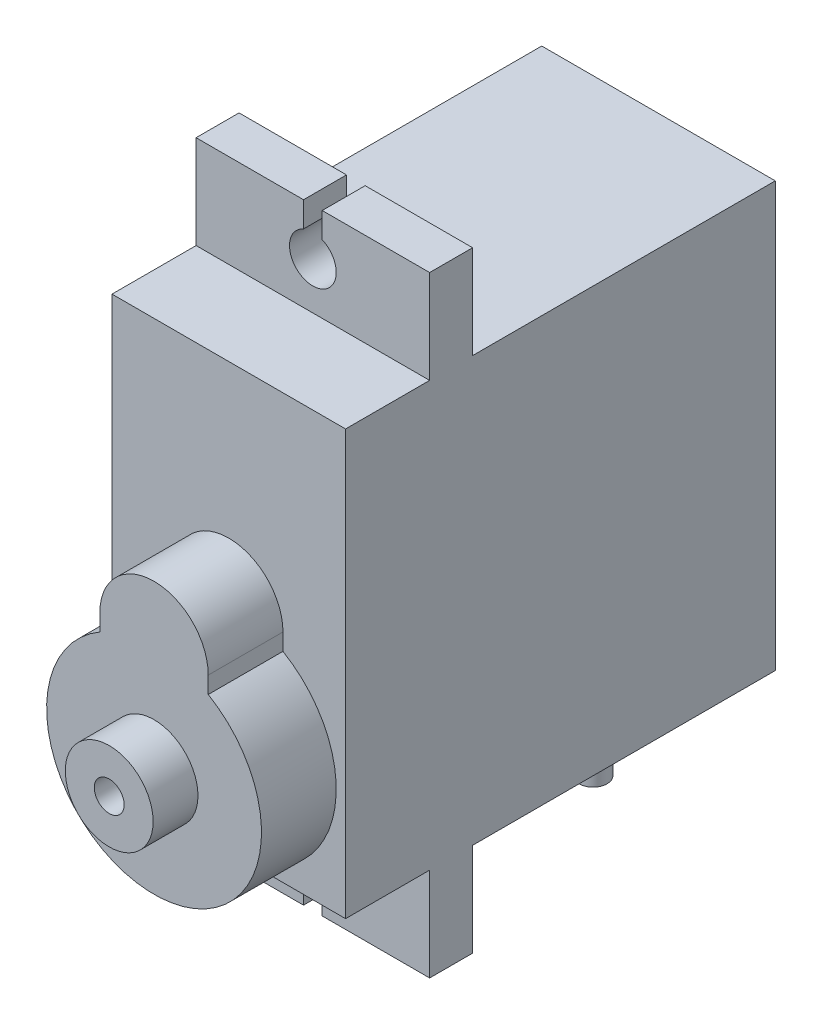
ISO-10303-21;
HEADER;
FILE_DESCRIPTION(('STEP AP214'),'2;1');
FILE_NAME('part.step','',(''),(''),'','','');
FILE_SCHEMA(('AUTOMOTIVE_DESIGN { 1 0 10303 214 1 1 1 1 }'));
ENDSEC;
DATA;
#1=APPLICATION_CONTEXT('core data for automotive mechanical design processes');
#2=APPLICATION_PROTOCOL_DEFINITION('international standard','automotive_design',2000,#1);
#3=PRODUCT_CONTEXT('',#1,'mechanical');
#4=PRODUCT('Part','Part','',(#3));
#5=PRODUCT_RELATED_PRODUCT_CATEGORY('part','',(#4));
#6=PRODUCT_DEFINITION_FORMATION('','',#4);
#7=PRODUCT_DEFINITION_CONTEXT('part definition',#1,'design');
#8=PRODUCT_DEFINITION('design','',#6,#7);
#9=PRODUCT_DEFINITION_SHAPE('','',#8);
#10=(LENGTH_UNIT() NAMED_UNIT(*) SI_UNIT(.MILLI.,.METRE.));
#11=(NAMED_UNIT(*) PLANE_ANGLE_UNIT() SI_UNIT($,.RADIAN.));
#12=(NAMED_UNIT(*) SI_UNIT($,.STERADIAN.) SOLID_ANGLE_UNIT());
#13=UNCERTAINTY_MEASURE_WITH_UNIT(LENGTH_MEASURE(1.E-05),#10,'distance_accuracy_value','');
#14=(GEOMETRIC_REPRESENTATION_CONTEXT(3) GLOBAL_UNCERTAINTY_ASSIGNED_CONTEXT((#13)) GLOBAL_UNIT_ASSIGNED_CONTEXT((#10,
#11,#12)) REPRESENTATION_CONTEXT('',''));
#15=CARTESIAN_POINT('',(0.,0.,0.));
#16=DIRECTION('',(0.,0.,1.));
#17=DIRECTION('',(1.,0.,0.));
#18=AXIS2_PLACEMENT_3D('',#15,#16,#17);
#19=CARTESIAN_POINT('',(-6.25000000000001,-11.35,23.));
#20=DIRECTION('',(0.,1.,0.));
#21=DIRECTION('',(0.,0.,1.));
#22=AXIS2_PLACEMENT_3D('',#19,#20,#21);
#23=PLANE('',#22);
#24=DIRECTION('',(-1.,0.,0.));
#25=VECTOR('',#24,1.);
#26=CARTESIAN_POINT('',(6.25,-11.35,16.2));
#27=LINE('',#26,#25);
#28=CARTESIAN_POINT('',(6.24999999999999,-11.35,16.2));
#29=VERTEX_POINT('',#28);
#30=CARTESIAN_POINT('',(-6.25,-11.35,16.2));
#31=VERTEX_POINT('',#30);
#32=EDGE_CURVE('E334',#29,#31,#27,.T.);
#33=ORIENTED_EDGE('',*,*,#32,.T.);
#34=DIRECTION('',(0.,0.,-1.));
#35=VECTOR('',#34,1.);
#36=CARTESIAN_POINT('',(-6.25000000000001,-11.35,23.));
#37=LINE('',#36,#35);
#38=CARTESIAN_POINT('',(-6.25000000000001,-11.35,0.));
#39=VERTEX_POINT('',#38);
#40=EDGE_CURVE('E409',#31,#39,#37,.T.);
#41=ORIENTED_EDGE('',*,*,#40,.T.);
#42=DIRECTION('',(1.,0.,0.));
#43=VECTOR('',#42,1.);
#44=CARTESIAN_POINT('',(-6.25000000000001,-11.35,0.));
#45=LINE('',#44,#43);
#46=CARTESIAN_POINT('',(6.24999999999999,-11.35,0.));
#47=VERTEX_POINT('',#46);
#48=EDGE_CURVE('E504',#39,#47,#45,.T.);
#49=ORIENTED_EDGE('',*,*,#48,.T.);
#50=DIRECTION('',(0.,0.,-1.));
#51=VECTOR('',#50,1.);
#52=CARTESIAN_POINT('',(6.24999999999999,-11.35,23.));
#53=LINE('',#52,#51);
#54=EDGE_CURVE('E497',#29,#47,#53,.T.);
#55=ORIENTED_EDGE('',*,*,#54,.F.);
#56=EDGE_LOOP('',(#33,#41,#49,#55));
#57=FACE_BOUND('',#56,.T.);
#58=CARTESIAN_POINT('',(1.25,-11.35,4.75));
#59=DIRECTION('',(0.,1.,0.));
#60=DIRECTION('',(0.,0.,1.));
#61=AXIS2_PLACEMENT_3D('',#58,#59,#60);
#62=CIRCLE('',#61,0.75);
#63=CARTESIAN_POINT('',(0.625,-11.35,4.33542190120558));
#64=VERTEX_POINT('',#63);
#65=CARTESIAN_POINT('',(0.625000000000001,-11.35,5.16457809879443));
#66=VERTEX_POINT('',#65);
#67=EDGE_CURVE('E246',#64,#66,#62,.F.);
#68=ORIENTED_EDGE('',*,*,#67,.F.);
#69=CARTESIAN_POINT('',(0.,-11.35,4.75));
#70=DIRECTION('',(0.,1.,0.));
#71=DIRECTION('',(0.,0.,1.));
#72=AXIS2_PLACEMENT_3D('',#69,#70,#71);
#73=CIRCLE('',#72,0.75);
#74=CARTESIAN_POINT('',(-0.625,-11.35,4.33542190120558));
#75=VERTEX_POINT('',#74);
#76=EDGE_CURVE('E258',#75,#64,#73,.F.);
#77=ORIENTED_EDGE('',*,*,#76,.F.);
#78=CARTESIAN_POINT('',(-1.25,-11.35,4.75));
#79=DIRECTION('',(0.,1.,0.));
#80=DIRECTION('',(0.,0.,1.));
#81=AXIS2_PLACEMENT_3D('',#78,#79,#80);
#82=CIRCLE('',#81,0.75);
#83=CARTESIAN_POINT('',(-0.625,-11.35,5.16457809879442));
#84=VERTEX_POINT('',#83);
#85=EDGE_CURVE('E245',#84,#75,#82,.F.);
#86=ORIENTED_EDGE('',*,*,#85,.F.);
#87=CARTESIAN_POINT('',(0.,-11.35,4.75));
#88=DIRECTION('',(0.,1.,0.));
#89=DIRECTION('',(0.,0.,1.));
#90=AXIS2_PLACEMENT_3D('',#87,#88,#89);
#91=CIRCLE('',#90,0.75);
#92=EDGE_CURVE('E235',#66,#84,#91,.F.);
#93=ORIENTED_EDGE('',*,*,#92,.F.);
#94=EDGE_LOOP('',(#68,#77,#86,#93));
#95=FACE_BOUND('',#94,.T.);
#96=ADVANCED_FACE('F45',(#57,#95),#23,.F.);
#97=CARTESIAN_POINT('',(6.25,-16.35,16.2));
#98=DIRECTION('',(0.,1.,0.));
#99=DIRECTION('',(0.,0.,1.));
#100=AXIS2_PLACEMENT_3D('',#97,#98,#99);
#101=PLANE('',#100);
#102=DIRECTION('',(-1.,0.,0.));
#103=VECTOR('',#102,1.);
#104=CARTESIAN_POINT('',(6.25,-16.35,18.5));
#105=LINE('',#104,#103);
#106=CARTESIAN_POINT('',(6.25,-16.35,18.5));
#107=VERTEX_POINT('',#106);
#108=CARTESIAN_POINT('',(0.5,-16.35,18.5));
#109=VERTEX_POINT('',#108);
#110=EDGE_CURVE('E349',#107,#109,#105,.T.);
#111=ORIENTED_EDGE('',*,*,#110,.T.);
#112=DIRECTION('',(0.,0.,1.));
#113=VECTOR('',#112,1.);
#114=CARTESIAN_POINT('',(0.5,-16.35,-0.00102500000000172));
#115=LINE('',#114,#113);
#116=CARTESIAN_POINT('',(0.5,-16.35,16.2));
#117=VERTEX_POINT('',#116);
#118=EDGE_CURVE('E297',#117,#109,#115,.T.);
#119=ORIENTED_EDGE('',*,*,#118,.F.);
#120=DIRECTION('',(-1.,0.,0.));
#121=VECTOR('',#120,1.);
#122=CARTESIAN_POINT('',(6.25,-16.35,16.2));
#123=LINE('',#122,#121);
#124=CARTESIAN_POINT('',(6.25,-16.35,16.2));
#125=VERTEX_POINT('',#124);
#126=EDGE_CURVE('E345',#125,#117,#123,.T.);
#127=ORIENTED_EDGE('',*,*,#126,.F.);
#128=DIRECTION('',(0.,0.,-1.));
#129=VECTOR('',#128,1.);
#130=CARTESIAN_POINT('',(6.25,-16.35,16.2));
#131=LINE('',#130,#129);
#132=EDGE_CURVE('E328',#107,#125,#131,.T.);
#133=ORIENTED_EDGE('',*,*,#132,.F.);
#134=EDGE_LOOP('',(#111,#119,#127,#133));
#135=FACE_BOUND('',#134,.T.);
#136=ADVANCED_FACE('F570',(#135),#101,.F.);
#137=CARTESIAN_POINT('',(6.25,16.35,16.2));
#138=DIRECTION('',(0.,-1.,0.));
#139=DIRECTION('',(0.,0.,-1.));
#140=AXIS2_PLACEMENT_3D('',#137,#138,#139);
#141=PLANE('',#140);
#142=DIRECTION('',(-1.,0.,0.));
#143=VECTOR('',#142,1.);
#144=CARTESIAN_POINT('',(6.25,16.35,16.2));
#145=LINE('',#144,#143);
#146=CARTESIAN_POINT('',(6.25,16.35,16.2));
#147=VERTEX_POINT('',#146);
#148=CARTESIAN_POINT('',(0.5,16.35,16.2));
#149=VERTEX_POINT('',#148);
#150=EDGE_CURVE('E463',#147,#149,#145,.T.);
#151=ORIENTED_EDGE('',*,*,#150,.T.);
#152=DIRECTION('',(0.,0.,1.));
#153=VECTOR('',#152,1.);
#154=CARTESIAN_POINT('',(0.5,16.35,-0.00102500000000172));
#155=LINE('',#154,#153);
#156=CARTESIAN_POINT('',(0.5,16.35,18.5));
#157=VERTEX_POINT('',#156);
#158=EDGE_CURVE('E317',#149,#157,#155,.T.);
#159=ORIENTED_EDGE('',*,*,#158,.T.);
#160=DIRECTION('',(-1.,0.,0.));
#161=VECTOR('',#160,1.);
#162=CARTESIAN_POINT('',(6.25,16.35,18.5));
#163=LINE('',#162,#161);
#164=CARTESIAN_POINT('',(6.25,16.35,18.5));
#165=VERTEX_POINT('',#164);
#166=EDGE_CURVE('E476',#165,#157,#163,.T.);
#167=ORIENTED_EDGE('',*,*,#166,.F.);
#168=DIRECTION('',(0.,0.,1.));
#169=VECTOR('',#168,1.);
#170=CARTESIAN_POINT('',(6.25,16.35,16.2));
#171=LINE('',#170,#169);
#172=EDGE_CURVE('E356',#147,#165,#171,.T.);
#173=ORIENTED_EDGE('',*,*,#172,.F.);
#174=EDGE_LOOP('',(#151,#159,#167,#173));
#175=FACE_BOUND('',#174,.T.);
#176=ADVANCED_FACE('F577',(#175),#141,.F.);
#177=DIRECTION('',(-1.,0.,0.));
#178=VECTOR('',#177,1.);
#179=CARTESIAN_POINT('',(6.25,-11.35,18.5));
#180=LINE('',#179,#178);
#181=CARTESIAN_POINT('',(6.24999999999999,-11.35,18.5));
#182=VERTEX_POINT('',#181);
#183=CARTESIAN_POINT('',(-6.25000000000001,-11.35,18.5));
#184=VERTEX_POINT('',#183);
#185=EDGE_CURVE('E352',#182,#184,#180,.T.);
#186=ORIENTED_EDGE('',*,*,#185,.F.);
#187=CARTESIAN_POINT('',(6.24999999999999,-11.35,23.));
#188=VERTEX_POINT('',#187);
#189=EDGE_CURVE('E506',#188,#182,#53,.T.);
#190=ORIENTED_EDGE('',*,*,#189,.F.);
#191=DIRECTION('',(1.,0.,0.));
#192=VECTOR('',#191,1.);
#193=CARTESIAN_POINT('',(-6.25000000000001,-11.35,23.));
#194=LINE('',#193,#192);
#195=CARTESIAN_POINT('',(0.,-11.35,23.));
#196=VERTEX_POINT('',#195);
#197=EDGE_CURVE('E489',#196,#188,#194,.T.);
#198=ORIENTED_EDGE('',*,*,#197,.F.);
#199=CARTESIAN_POINT('',(-6.25000000000001,-11.35,23.));
#200=VERTEX_POINT('',#199);
#201=EDGE_CURVE('E491',#200,#196,#194,.T.);
#202=ORIENTED_EDGE('',*,*,#201,.F.);
#203=EDGE_CURVE('E404',#200,#184,#37,.T.);
#204=ORIENTED_EDGE('',*,*,#203,.T.);
#205=EDGE_LOOP('',(#186,#190,#198,#202,#204));
#206=FACE_BOUND('',#205,.T.);
#207=ADVANCED_FACE('F531',(#206),#23,.F.);
#208=CARTESIAN_POINT('',(-6.25000000000001,11.35,23.));
#209=DIRECTION('',(0.,-1.,0.));
#210=DIRECTION('',(0.,0.,-1.));
#211=AXIS2_PLACEMENT_3D('',#208,#209,#210);
#212=PLANE('',#211);
#213=DIRECTION('',(-1.,0.,0.));
#214=VECTOR('',#213,1.);
#215=CARTESIAN_POINT('',(6.25,11.35,16.2));
#216=LINE('',#215,#214);
#217=CARTESIAN_POINT('',(6.25,11.35,16.2));
#218=VERTEX_POINT('',#217);
#219=CARTESIAN_POINT('',(-6.25,11.35,16.2));
#220=VERTEX_POINT('',#219);
#221=EDGE_CURVE('E369',#218,#220,#216,.T.);
#222=ORIENTED_EDGE('',*,*,#221,.F.);
#223=DIRECTION('',(0.,0.,-1.));
#224=VECTOR('',#223,1.);
#225=CARTESIAN_POINT('',(6.24999999999999,11.35,23.));
#226=LINE('',#225,#224);
#227=CARTESIAN_POINT('',(6.24999999999999,11.35,0.));
#228=VERTEX_POINT('',#227);
#229=EDGE_CURVE('E407',#218,#228,#226,.T.);
#230=ORIENTED_EDGE('',*,*,#229,.T.);
#231=DIRECTION('',(-1.,0.,0.));
#232=VECTOR('',#231,1.);
#233=CARTESIAN_POINT('',(-6.25000000000001,11.35,0.));
#234=LINE('',#233,#232);
#235=CARTESIAN_POINT('',(-6.25000000000001,11.35,0.));
#236=VERTEX_POINT('',#235);
#237=EDGE_CURVE('E401',#228,#236,#234,.T.);
#238=ORIENTED_EDGE('',*,*,#237,.T.);
#239=DIRECTION('',(0.,0.,-1.));
#240=VECTOR('',#239,1.);
#241=CARTESIAN_POINT('',(-6.25000000000001,11.35,23.));
#242=LINE('',#241,#240);
#243=EDGE_CURVE('E394',#220,#236,#242,.T.);
#244=ORIENTED_EDGE('',*,*,#243,.F.);
#245=EDGE_LOOP('',(#222,#230,#238,#244));
#246=FACE_BOUND('',#245,.T.);
#247=ADVANCED_FACE('F398',(#246),#212,.F.);
#248=CARTESIAN_POINT('',(0.,0.,23.));
#249=DIRECTION('',(0.,0.,-1.));
#250=DIRECTION('',(-1.,0.,0.));
#251=AXIS2_PLACEMENT_3D('',#248,#249,#250);
#252=PLANE('',#251);
#253=DIRECTION('',(0.,1.,0.));
#254=VECTOR('',#253,1.);
#255=CARTESIAN_POINT('',(2.9,0.26512839713135,23.));
#256=LINE('',#255,#254);
#257=CARTESIAN_POINT('',(2.9,-0.634871602868653,23.));
#258=VERTEX_POINT('',#257);
#259=CARTESIAN_POINT('',(2.9,0.26512839713135,23.));
#260=VERTEX_POINT('',#259);
#261=EDGE_CURVE('E452',#258,#260,#256,.T.);
#262=ORIENTED_EDGE('',*,*,#261,.F.);
#263=CARTESIAN_POINT('',(0.,-5.59999999999999,23.));
#264=DIRECTION('',(0.,0.,1.));
#265=DIRECTION('',(1.,0.,0.));
#266=AXIS2_PLACEMENT_3D('',#263,#264,#265);
#267=CIRCLE('',#266,5.75);
#268=EDGE_CURVE('E53',#196,#258,#267,.T.);
#269=ORIENTED_EDGE('',*,*,#268,.F.);
#270=ORIENTED_EDGE('',*,*,#197,.T.);
#271=DIRECTION('',(0.,1.,0.));
#272=VECTOR('',#271,1.);
#273=CARTESIAN_POINT('',(6.24999999999999,-11.35,23.));
#274=LINE('',#273,#272);
#275=CARTESIAN_POINT('',(6.24999999999999,11.35,23.));
#276=VERTEX_POINT('',#275);
#277=EDGE_CURVE('E493',#188,#276,#274,.T.);
#278=ORIENTED_EDGE('',*,*,#277,.T.);
#279=DIRECTION('',(-1.,0.,0.));
#280=VECTOR('',#279,1.);
#281=CARTESIAN_POINT('',(-6.25000000000001,11.35,23.));
#282=LINE('',#281,#280);
#283=CARTESIAN_POINT('',(-6.25000000000001,11.35,23.));
#284=VERTEX_POINT('',#283);
#285=EDGE_CURVE('E441',#276,#284,#282,.T.);
#286=ORIENTED_EDGE('',*,*,#285,.T.);
#287=DIRECTION('',(0.,-1.,0.));
#288=VECTOR('',#287,1.);
#289=CARTESIAN_POINT('',(-6.25000000000001,-11.35,23.));
#290=LINE('',#289,#288);
#291=EDGE_CURVE('E484',#284,#200,#290,.T.);
#292=ORIENTED_EDGE('',*,*,#291,.T.);
#293=ORIENTED_EDGE('',*,*,#201,.T.);
#294=CARTESIAN_POINT('',(-2.9,-0.634871602868654,23.));
#295=VERTEX_POINT('',#294);
#296=EDGE_CURVE('E445',#295,#196,#267,.T.);
#297=ORIENTED_EDGE('',*,*,#296,.F.);
#298=DIRECTION('',(0.,-1.,0.));
#299=VECTOR('',#298,1.);
#300=CARTESIAN_POINT('',(-2.9,0.26512839713135,23.));
#301=LINE('',#300,#299);
#302=CARTESIAN_POINT('',(-2.9,0.26512839713135,23.));
#303=VERTEX_POINT('',#302);
#304=EDGE_CURVE('E453',#303,#295,#301,.T.);
#305=ORIENTED_EDGE('',*,*,#304,.F.);
#306=CARTESIAN_POINT('',(0.,0.26512839713135,23.));
#307=DIRECTION('',(0.,0.,1.));
#308=DIRECTION('',(1.,0.,0.));
#309=AXIS2_PLACEMENT_3D('',#306,#307,#308);
#310=CIRCLE('',#309,2.9);
#311=EDGE_CURVE('E458',#260,#303,#310,.T.);
#312=ORIENTED_EDGE('',*,*,#311,.F.);
#313=EDGE_LOOP('',(#262,#269,#270,#278,#286,#292,#293,#297,#305,#312));
#314=FACE_BOUND('',#313,.T.);
#315=ADVANCED_FACE('F533',(#314),#252,.F.);
#316=CARTESIAN_POINT('',(6.24999999999999,-11.35,23.));
#317=DIRECTION('',(-1.,0.,0.));
#318=DIRECTION('',(0.,0.,1.));
#319=AXIS2_PLACEMENT_3D('',#316,#317,#318);
#320=PLANE('',#319);
#321=DIRECTION('',(0.,1.,0.));
#322=VECTOR('',#321,1.);
#323=CARTESIAN_POINT('',(6.24999999999999,-11.35,0.));
#324=LINE('',#323,#322);
#325=EDGE_CURVE('E498',#47,#228,#324,.T.);
#326=ORIENTED_EDGE('',*,*,#325,.T.);
#327=ORIENTED_EDGE('',*,*,#229,.F.);
#328=DIRECTION('',(0.,1.,0.));
#329=VECTOR('',#328,1.);
#330=CARTESIAN_POINT('',(6.25,11.35,16.2));
#331=LINE('',#330,#329);
#332=EDGE_CURVE('E359',#218,#147,#331,.T.);
#333=ORIENTED_EDGE('',*,*,#332,.T.);
#334=ORIENTED_EDGE('',*,*,#172,.T.);
#335=DIRECTION('',(0.,-1.,0.));
#336=VECTOR('',#335,1.);
#337=CARTESIAN_POINT('',(6.25,11.35,18.5));
#338=LINE('',#337,#336);
#339=CARTESIAN_POINT('',(6.25,11.35,18.5));
#340=VERTEX_POINT('',#339);
#341=EDGE_CURVE('E358',#165,#340,#338,.T.);
#342=ORIENTED_EDGE('',*,*,#341,.T.);
#343=EDGE_CURVE('E414',#276,#340,#226,.T.);
#344=ORIENTED_EDGE('',*,*,#343,.F.);
#345=ORIENTED_EDGE('',*,*,#277,.F.);
#346=ORIENTED_EDGE('',*,*,#189,.T.);
#347=DIRECTION('',(0.,-1.,0.));
#348=VECTOR('',#347,1.);
#349=CARTESIAN_POINT('',(6.25,-11.35,18.5));
#350=LINE('',#349,#348);
#351=EDGE_CURVE('E326',#182,#107,#350,.T.);
#352=ORIENTED_EDGE('',*,*,#351,.T.);
#353=ORIENTED_EDGE('',*,*,#132,.T.);
#354=DIRECTION('',(0.,1.,0.));
#355=VECTOR('',#354,1.);
#356=CARTESIAN_POINT('',(6.25,-11.35,16.2));
#357=LINE('',#356,#355);
#358=EDGE_CURVE('E331',#125,#29,#357,.T.);
#359=ORIENTED_EDGE('',*,*,#358,.T.);
#360=ORIENTED_EDGE('',*,*,#54,.T.);
#361=EDGE_LOOP('',(#326,#327,#333,#334,#342,#344,#345,#346,#352,#353,#359,#360));
#362=FACE_BOUND('',#361,.T.);
#363=ADVANCED_FACE('F47',(#362),#320,.F.);
#364=ORIENTED_EDGE('',*,*,#343,.T.);
#365=DIRECTION('',(-1.,0.,0.));
#366=VECTOR('',#365,1.);
#367=CARTESIAN_POINT('',(6.25,11.35,18.5));
#368=LINE('',#367,#366);
#369=CARTESIAN_POINT('',(-6.25000000000001,11.35,18.5));
#370=VERTEX_POINT('',#369);
#371=EDGE_CURVE('E372',#340,#370,#368,.T.);
#372=ORIENTED_EDGE('',*,*,#371,.T.);
#373=EDGE_CURVE('E403',#284,#370,#242,.T.);
#374=ORIENTED_EDGE('',*,*,#373,.F.);
#375=ORIENTED_EDGE('',*,*,#285,.F.);
#376=EDGE_LOOP('',(#364,#372,#374,#375));
#377=FACE_BOUND('',#376,.T.);
#378=ADVANCED_FACE('F440',(#377),#212,.F.);
#379=CARTESIAN_POINT('',(-6.25000000000001,-11.35,23.));
#380=DIRECTION('',(1.,0.,0.));
#381=DIRECTION('',(0.,0.,-1.));
#382=AXIS2_PLACEMENT_3D('',#379,#380,#381);
#383=PLANE('',#382);
#384=DIRECTION('',(0.,-1.,0.));
#385=VECTOR('',#384,1.);
#386=CARTESIAN_POINT('',(-6.25000000000001,-11.35,0.));
#387=LINE('',#386,#385);
#388=EDGE_CURVE('E502',#236,#39,#387,.T.);
#389=ORIENTED_EDGE('',*,*,#388,.T.);
#390=ORIENTED_EDGE('',*,*,#40,.F.);
#391=DIRECTION('',(0.,1.,0.));
#392=VECTOR('',#391,1.);
#393=CARTESIAN_POINT('',(-6.25,-11.35,16.2));
#394=LINE('',#393,#392);
#395=CARTESIAN_POINT('',(-6.25,-16.35,16.2));
#396=VERTEX_POINT('',#395);
#397=EDGE_CURVE('E329',#396,#31,#394,.T.);
#398=ORIENTED_EDGE('',*,*,#397,.F.);
#399=DIRECTION('',(0.,0.,-1.));
#400=VECTOR('',#399,1.);
#401=CARTESIAN_POINT('',(-6.25,-16.35,16.2));
#402=LINE('',#401,#400);
#403=CARTESIAN_POINT('',(-6.25,-16.35,18.5));
#404=VERTEX_POINT('',#403);
#405=EDGE_CURVE('E337',#404,#396,#402,.T.);
#406=ORIENTED_EDGE('',*,*,#405,.F.);
#407=DIRECTION('',(0.,-1.,0.));
#408=VECTOR('',#407,1.);
#409=CARTESIAN_POINT('',(-6.25,-11.35,18.5));
#410=LINE('',#409,#408);
#411=EDGE_CURVE('E320',#184,#404,#410,.T.);
#412=ORIENTED_EDGE('',*,*,#411,.F.);
#413=ORIENTED_EDGE('',*,*,#203,.F.);
#414=ORIENTED_EDGE('',*,*,#291,.F.);
#415=ORIENTED_EDGE('',*,*,#373,.T.);
#416=DIRECTION('',(0.,-1.,0.));
#417=VECTOR('',#416,1.);
#418=CARTESIAN_POINT('',(-6.25,11.35,18.5));
#419=LINE('',#418,#417);
#420=CARTESIAN_POINT('',(-6.25,16.35,18.5));
#421=VERTEX_POINT('',#420);
#422=EDGE_CURVE('E363',#421,#370,#419,.T.);
#423=ORIENTED_EDGE('',*,*,#422,.F.);
#424=DIRECTION('',(0.,0.,1.));
#425=VECTOR('',#424,1.);
#426=CARTESIAN_POINT('',(-6.25,16.35,16.2));
#427=LINE('',#426,#425);
#428=CARTESIAN_POINT('',(-6.25,16.35,16.2));
#429=VERTEX_POINT('',#428);
#430=EDGE_CURVE('E360',#429,#421,#427,.T.);
#431=ORIENTED_EDGE('',*,*,#430,.F.);
#432=DIRECTION('',(0.,1.,0.));
#433=VECTOR('',#432,1.);
#434=CARTESIAN_POINT('',(-6.25,11.35,16.2));
#435=LINE('',#434,#433);
#436=EDGE_CURVE('E355',#220,#429,#435,.T.);
#437=ORIENTED_EDGE('',*,*,#436,.F.);
#438=ORIENTED_EDGE('',*,*,#243,.T.);
#439=EDGE_LOOP('',(#389,#390,#398,#406,#412,#413,#414,#415,#423,#431,#437,#438));
#440=FACE_BOUND('',#439,.T.);
#441=ADVANCED_FACE('F393',(#440),#383,.F.);
#442=CARTESIAN_POINT('',(0.,0.,0.));
#443=DIRECTION('',(0.,0.,-1.));
#444=DIRECTION('',(-1.,0.,0.));
#445=AXIS2_PLACEMENT_3D('',#442,#443,#444);
#446=PLANE('',#445);
#447=ORIENTED_EDGE('',*,*,#325,.F.);
#448=ORIENTED_EDGE('',*,*,#48,.F.);
#449=ORIENTED_EDGE('',*,*,#388,.F.);
#450=ORIENTED_EDGE('',*,*,#237,.F.);
#451=EDGE_LOOP('',(#447,#448,#449,#450));
#452=FACE_BOUND('',#451,.T.);
#453=ADVANCED_FACE('F516',(#452),#446,.T.);
#454=CARTESIAN_POINT('',(0.,0.26512839713135,27.));
#455=DIRECTION('',(0.,0.,-1.));
#456=DIRECTION('',(-1.,0.,0.));
#457=AXIS2_PLACEMENT_3D('',#454,#455,#456);
#458=CYLINDRICAL_SURFACE('',#457,2.9);
#459=ORIENTED_EDGE('',*,*,#311,.T.);
#460=DIRECTION('',(0.,0.,-1.));
#461=VECTOR('',#460,1.);
#462=CARTESIAN_POINT('',(-2.9,0.26512839713135,27.));
#463=LINE('',#462,#461);
#464=CARTESIAN_POINT('',(-2.9,0.26512839713135,27.));
#465=VERTEX_POINT('',#464);
#466=EDGE_CURVE('E500',#465,#303,#463,.T.);
#467=ORIENTED_EDGE('',*,*,#466,.F.);
#468=CARTESIAN_POINT('',(0.,0.26512839713135,27.));
#469=DIRECTION('',(0.,0.,1.));
#470=DIRECTION('',(1.,0.,0.));
#471=AXIS2_PLACEMENT_3D('',#468,#469,#470);
#472=CIRCLE('',#471,2.9);
#473=CARTESIAN_POINT('',(2.9,0.26512839713135,27.));
#474=VERTEX_POINT('',#473);
#475=EDGE_CURVE('E456',#474,#465,#472,.T.);
#476=ORIENTED_EDGE('',*,*,#475,.F.);
#477=DIRECTION('',(0.,0.,-1.));
#478=VECTOR('',#477,1.);
#479=CARTESIAN_POINT('',(2.9,0.26512839713135,27.));
#480=LINE('',#479,#478);
#481=EDGE_CURVE('E468',#474,#260,#480,.T.);
#482=ORIENTED_EDGE('',*,*,#481,.T.);
#483=EDGE_LOOP('',(#459,#467,#476,#482));
#484=FACE_BOUND('',#483,.T.);
#485=ADVANCED_FACE('F541',(#484),#458,.T.);
#486=CARTESIAN_POINT('',(-2.9,0.26512839713135,27.));
#487=DIRECTION('',(1.,0.,0.));
#488=DIRECTION('',(0.,0.,-1.));
#489=AXIS2_PLACEMENT_3D('',#486,#487,#488);
#490=PLANE('',#489);
#491=ORIENTED_EDGE('',*,*,#304,.T.);
#492=DIRECTION('',(0.,0.,-1.));
#493=VECTOR('',#492,1.);
#494=CARTESIAN_POINT('',(-2.9,-0.634871602868654,27.));
#495=LINE('',#494,#493);
#496=CARTESIAN_POINT('',(-2.9,-0.634871602868654,27.));
#497=VERTEX_POINT('',#496);
#498=EDGE_CURVE('E538',#497,#295,#495,.T.);
#499=ORIENTED_EDGE('',*,*,#498,.F.);
#500=DIRECTION('',(0.,-1.,0.));
#501=VECTOR('',#500,1.);
#502=CARTESIAN_POINT('',(-2.9,0.26512839713135,27.));
#503=LINE('',#502,#501);
#504=EDGE_CURVE('E471',#465,#497,#503,.T.);
#505=ORIENTED_EDGE('',*,*,#504,.F.);
#506=ORIENTED_EDGE('',*,*,#466,.T.);
#507=EDGE_LOOP('',(#491,#499,#505,#506));
#508=FACE_BOUND('',#507,.T.);
#509=ADVANCED_FACE('F535',(#508),#490,.F.);
#510=CARTESIAN_POINT('',(0.,-5.59999999999999,27.));
#511=DIRECTION('',(0.,0.,-1.));
#512=DIRECTION('',(-1.,0.,0.));
#513=AXIS2_PLACEMENT_3D('',#510,#511,#512);
#514=CYLINDRICAL_SURFACE('',#513,5.75);
#515=ORIENTED_EDGE('',*,*,#296,.T.);
#516=ORIENTED_EDGE('',*,*,#268,.T.);
#517=DIRECTION('',(0.,0.,-1.));
#518=VECTOR('',#517,1.);
#519=CARTESIAN_POINT('',(2.9,-0.634871602868653,27.));
#520=LINE('',#519,#518);
#521=CARTESIAN_POINT('',(2.9,-0.634871602868653,27.));
#522=VERTEX_POINT('',#521);
#523=EDGE_CURVE('E545',#522,#258,#520,.T.);
#524=ORIENTED_EDGE('',*,*,#523,.F.);
#525=CARTESIAN_POINT('',(0.,-5.59999999999999,27.));
#526=DIRECTION('',(0.,0.,1.));
#527=DIRECTION('',(1.,0.,0.));
#528=AXIS2_PLACEMENT_3D('',#525,#526,#527);
#529=CIRCLE('',#528,5.75);
#530=EDGE_CURVE('E469',#497,#522,#529,.T.);
#531=ORIENTED_EDGE('',*,*,#530,.F.);
#532=ORIENTED_EDGE('',*,*,#498,.T.);
#533=EDGE_LOOP('',(#515,#516,#524,#531,#532));
#534=FACE_BOUND('',#533,.T.);
#535=ADVANCED_FACE('F551',(#534),#514,.T.);
#536=CARTESIAN_POINT('',(2.9,0.26512839713135,27.));
#537=DIRECTION('',(-1.,0.,0.));
#538=DIRECTION('',(0.,0.,1.));
#539=AXIS2_PLACEMENT_3D('',#536,#537,#538);
#540=PLANE('',#539);
#541=ORIENTED_EDGE('',*,*,#261,.T.);
#542=ORIENTED_EDGE('',*,*,#481,.F.);
#543=DIRECTION('',(0.,1.,0.));
#544=VECTOR('',#543,1.);
#545=CARTESIAN_POINT('',(2.9,0.26512839713135,27.));
#546=LINE('',#545,#544);
#547=EDGE_CURVE('E466',#522,#474,#546,.T.);
#548=ORIENTED_EDGE('',*,*,#547,.F.);
#549=ORIENTED_EDGE('',*,*,#523,.T.);
#550=EDGE_LOOP('',(#541,#542,#548,#549));
#551=FACE_BOUND('',#550,.T.);
#552=ADVANCED_FACE('F549',(#551),#540,.F.);
#553=CARTESIAN_POINT('',(0.,0.26512839713135,27.));
#554=DIRECTION('',(0.,0.,1.));
#555=DIRECTION('',(1.,0.,0.));
#556=AXIS2_PLACEMENT_3D('',#553,#554,#555);
#557=PLANE('',#556);
#558=CARTESIAN_POINT('',(0.,-5.59999999999999,27.));
#559=DIRECTION('',(0.,0.,1.));
#560=DIRECTION('',(1.,0.,0.));
#561=AXIS2_PLACEMENT_3D('',#558,#559,#560);
#562=CIRCLE('',#561,2.35);
#563=CARTESIAN_POINT('',(2.35,-5.59999999999999,27.));
#564=VERTEX_POINT('',#563);
#565=EDGE_CURVE('E274',#564,#564,#562,.T.);
#566=ORIENTED_EDGE('',*,*,#565,.F.);
#567=EDGE_LOOP('',(#566));
#568=FACE_BOUND('',#567,.T.);
#569=ORIENTED_EDGE('',*,*,#475,.T.);
#570=ORIENTED_EDGE('',*,*,#504,.T.);
#571=ORIENTED_EDGE('',*,*,#530,.T.);
#572=ORIENTED_EDGE('',*,*,#547,.T.);
#573=EDGE_LOOP('',(#569,#570,#571,#572));
#574=FACE_BOUND('',#573,.T.);
#575=ADVANCED_FACE('F553',(#568,#574),#557,.T.);
#576=CARTESIAN_POINT('',(6.25,11.35,16.2));
#577=DIRECTION('',(0.,0.,1.));
#578=DIRECTION('',(1.,0.,0.));
#579=AXIS2_PLACEMENT_3D('',#576,#577,#578);
#580=PLANE('',#579);
#581=CARTESIAN_POINT('',(0.,13.85,16.2));
#582=DIRECTION('',(0.,0.,1.));
#583=DIRECTION('',(1.,0.,0.));
#584=AXIS2_PLACEMENT_3D('',#581,#582,#583);
#585=CIRCLE('',#584,1.25);
#586=CARTESIAN_POINT('',(0.500000000000001,14.995643923739,16.2));
#587=VERTEX_POINT('',#586);
#588=CARTESIAN_POINT('',(-0.5,14.995643923739,16.2));
#589=VERTEX_POINT('',#588);
#590=EDGE_CURVE('E304',#587,#589,#585,.F.);
#591=ORIENTED_EDGE('',*,*,#590,.F.);
#592=DIRECTION('',(0.,-1.,0.));
#593=VECTOR('',#592,1.);
#594=CARTESIAN_POINT('',(0.5,16.35,16.2));
#595=LINE('',#594,#593);
#596=EDGE_CURVE('E307',#149,#587,#595,.T.);
#597=ORIENTED_EDGE('',*,*,#596,.F.);
#598=ORIENTED_EDGE('',*,*,#150,.F.);
#599=ORIENTED_EDGE('',*,*,#332,.F.);
#600=ORIENTED_EDGE('',*,*,#221,.T.);
#601=ORIENTED_EDGE('',*,*,#436,.T.);
#602=CARTESIAN_POINT('',(-0.5,16.35,16.2));
#603=VERTEX_POINT('',#602);
#604=EDGE_CURVE('E387',#603,#429,#145,.T.);
#605=ORIENTED_EDGE('',*,*,#604,.F.);
#606=DIRECTION('',(0.,1.,0.));
#607=VECTOR('',#606,1.);
#608=CARTESIAN_POINT('',(-0.5,16.35,16.2));
#609=LINE('',#608,#607);
#610=EDGE_CURVE('E302',#589,#603,#609,.T.);
#611=ORIENTED_EDGE('',*,*,#610,.F.);
#612=EDGE_LOOP('',(#591,#597,#598,#599,#600,#601,#605,#611));
#613=FACE_BOUND('',#612,.T.);
#614=ADVANCED_FACE('F385',(#613),#580,.F.);
#615=CARTESIAN_POINT('',(-0.5,16.35,18.5));
#616=VERTEX_POINT('',#615);
#617=EDGE_CURVE('E424',#616,#421,#163,.T.);
#618=ORIENTED_EDGE('',*,*,#617,.F.);
#619=DIRECTION('',(0.,0.,1.));
#620=VECTOR('',#619,1.);
#621=CARTESIAN_POINT('',(-0.5,16.35,-0.00102500000000172));
#622=LINE('',#621,#620);
#623=EDGE_CURVE('E68',#603,#616,#622,.T.);
#624=ORIENTED_EDGE('',*,*,#623,.F.);
#625=ORIENTED_EDGE('',*,*,#604,.T.);
#626=ORIENTED_EDGE('',*,*,#430,.T.);
#627=EDGE_LOOP('',(#618,#624,#625,#626));
#628=FACE_BOUND('',#627,.T.);
#629=ADVANCED_FACE('F481',(#628),#141,.F.);
#630=CARTESIAN_POINT('',(6.25,11.35,18.5));
#631=DIRECTION('',(0.,0.,-1.));
#632=DIRECTION('',(-1.,0.,0.));
#633=AXIS2_PLACEMENT_3D('',#630,#631,#632);
#634=PLANE('',#633);
#635=ORIENTED_EDGE('',*,*,#166,.T.);
#636=DIRECTION('',(0.,1.,0.));
#637=VECTOR('',#636,1.);
#638=CARTESIAN_POINT('',(0.5,16.35,18.5));
#639=LINE('',#638,#637);
#640=CARTESIAN_POINT('',(0.500000000000001,14.995643923739,18.5));
#641=VERTEX_POINT('',#640);
#642=EDGE_CURVE('E310',#641,#157,#639,.T.);
#643=ORIENTED_EDGE('',*,*,#642,.F.);
#644=CARTESIAN_POINT('',(0.,13.85,18.5));
#645=DIRECTION('',(0.,0.,1.));
#646=DIRECTION('',(1.,0.,0.));
#647=AXIS2_PLACEMENT_3D('',#644,#645,#646);
#648=CIRCLE('',#647,1.25);
#649=CARTESIAN_POINT('',(-0.5,14.995643923739,18.5));
#650=VERTEX_POINT('',#649);
#651=EDGE_CURVE('E314',#650,#641,#648,.T.);
#652=ORIENTED_EDGE('',*,*,#651,.F.);
#653=DIRECTION('',(0.,-1.,0.));
#654=VECTOR('',#653,1.);
#655=CARTESIAN_POINT('',(-0.5,16.35,18.5));
#656=LINE('',#655,#654);
#657=EDGE_CURVE('E312',#616,#650,#656,.T.);
#658=ORIENTED_EDGE('',*,*,#657,.F.);
#659=ORIENTED_EDGE('',*,*,#617,.T.);
#660=ORIENTED_EDGE('',*,*,#422,.T.);
#661=ORIENTED_EDGE('',*,*,#371,.F.);
#662=ORIENTED_EDGE('',*,*,#341,.F.);
#663=EDGE_LOOP('',(#635,#643,#652,#658,#659,#660,#661,#662));
#664=FACE_BOUND('',#663,.T.);
#665=ADVANCED_FACE('F437',(#664),#634,.F.);
#666=CARTESIAN_POINT('',(6.25,-11.35,18.5));
#667=DIRECTION('',(0.,0.,-1.));
#668=DIRECTION('',(0.,1.,0.));
#669=AXIS2_PLACEMENT_3D('',#666,#667,#668);
#670=PLANE('',#669);
#671=CARTESIAN_POINT('',(0.,-13.85,18.5));
#672=DIRECTION('',(0.,0.,1.));
#673=DIRECTION('',(-1.,0.,0.));
#674=AXIS2_PLACEMENT_3D('',#671,#672,#673);
#675=CIRCLE('',#674,1.25);
#676=CARTESIAN_POINT('',(0.5,-14.9956439237389,18.5));
#677=VERTEX_POINT('',#676);
#678=CARTESIAN_POINT('',(-0.5,-14.995643923739,18.5));
#679=VERTEX_POINT('',#678);
#680=EDGE_CURVE('E285',#677,#679,#675,.T.);
#681=ORIENTED_EDGE('',*,*,#680,.F.);
#682=DIRECTION('',(0.,1.,0.));
#683=VECTOR('',#682,1.);
#684=CARTESIAN_POINT('',(0.5,-16.35,18.5));
#685=LINE('',#684,#683);
#686=EDGE_CURVE('E290',#109,#677,#685,.T.);
#687=ORIENTED_EDGE('',*,*,#686,.F.);
#688=ORIENTED_EDGE('',*,*,#110,.F.);
#689=ORIENTED_EDGE('',*,*,#351,.F.);
#690=ORIENTED_EDGE('',*,*,#185,.T.);
#691=ORIENTED_EDGE('',*,*,#411,.T.);
#692=CARTESIAN_POINT('',(-0.5,-16.35,18.5));
#693=VERTEX_POINT('',#692);
#694=EDGE_CURVE('E348',#693,#404,#105,.T.);
#695=ORIENTED_EDGE('',*,*,#694,.F.);
#696=DIRECTION('',(0.,-1.,0.));
#697=VECTOR('',#696,1.);
#698=CARTESIAN_POINT('',(-0.5,-16.35,18.5));
#699=LINE('',#698,#697);
#700=EDGE_CURVE('E288',#679,#693,#699,.T.);
#701=ORIENTED_EDGE('',*,*,#700,.F.);
#702=EDGE_LOOP('',(#681,#687,#688,#689,#690,#691,#695,#701));
#703=FACE_BOUND('',#702,.T.);
#704=ADVANCED_FACE('F528',(#703),#670,.F.);
#705=CARTESIAN_POINT('',(-0.5,-16.35,16.2));
#706=VERTEX_POINT('',#705);
#707=EDGE_CURVE('E344',#706,#396,#123,.T.);
#708=ORIENTED_EDGE('',*,*,#707,.F.);
#709=DIRECTION('',(0.,0.,1.));
#710=VECTOR('',#709,1.);
#711=CARTESIAN_POINT('',(-0.5,-16.35,-0.00102500000000172));
#712=LINE('',#711,#710);
#713=EDGE_CURVE('E60',#706,#693,#712,.T.);
#714=ORIENTED_EDGE('',*,*,#713,.T.);
#715=ORIENTED_EDGE('',*,*,#694,.T.);
#716=ORIENTED_EDGE('',*,*,#405,.T.);
#717=EDGE_LOOP('',(#708,#714,#715,#716));
#718=FACE_BOUND('',#717,.T.);
#719=ADVANCED_FACE('F524',(#718),#101,.F.);
#720=CARTESIAN_POINT('',(6.25,-11.35,16.2));
#721=DIRECTION('',(0.,0.,1.));
#722=DIRECTION('',(0.,-1.,0.));
#723=AXIS2_PLACEMENT_3D('',#720,#721,#722);
#724=PLANE('',#723);
#725=ORIENTED_EDGE('',*,*,#126,.T.);
#726=DIRECTION('',(0.,-1.,0.));
#727=VECTOR('',#726,1.);
#728=CARTESIAN_POINT('',(0.5,-16.35,16.2));
#729=LINE('',#728,#727);
#730=CARTESIAN_POINT('',(0.5,-14.9956439237389,16.2));
#731=VERTEX_POINT('',#730);
#732=EDGE_CURVE('E283',#731,#117,#729,.T.);
#733=ORIENTED_EDGE('',*,*,#732,.F.);
#734=CARTESIAN_POINT('',(0.,-13.85,16.2));
#735=DIRECTION('',(0.,0.,1.));
#736=DIRECTION('',(0.,-1.,0.));
#737=AXIS2_PLACEMENT_3D('',#734,#735,#736);
#738=CIRCLE('',#737,1.25);
#739=CARTESIAN_POINT('',(-0.5,-14.995643923739,16.2));
#740=VERTEX_POINT('',#739);
#741=EDGE_CURVE('E278',#740,#731,#738,.F.);
#742=ORIENTED_EDGE('',*,*,#741,.F.);
#743=DIRECTION('',(0.,1.,0.));
#744=VECTOR('',#743,1.);
#745=CARTESIAN_POINT('',(-0.5,-16.35,16.2));
#746=LINE('',#745,#744);
#747=EDGE_CURVE('E296',#706,#740,#746,.T.);
#748=ORIENTED_EDGE('',*,*,#747,.F.);
#749=ORIENTED_EDGE('',*,*,#707,.T.);
#750=ORIENTED_EDGE('',*,*,#397,.T.);
#751=ORIENTED_EDGE('',*,*,#32,.F.);
#752=ORIENTED_EDGE('',*,*,#358,.F.);
#753=EDGE_LOOP('',(#725,#733,#742,#748,#749,#750,#751,#752));
#754=FACE_BOUND('',#753,.T.);
#755=ADVANCED_FACE('F520',(#754),#724,.F.);
#756=CARTESIAN_POINT('',(0.5,16.35,-0.00102500000000172));
#757=DIRECTION('',(1.,0.,0.));
#758=DIRECTION('',(0.,0.,-1.));
#759=AXIS2_PLACEMENT_3D('',#756,#757,#758);
#760=PLANE('',#759);
#761=ORIENTED_EDGE('',*,*,#596,.T.);
#762=DIRECTION('',(0.,0.,1.));
#763=VECTOR('',#762,1.);
#764=CARTESIAN_POINT('',(0.500000000000001,14.995643923739,-0.00102500000000172));
#765=LINE('',#764,#763);
#766=EDGE_CURVE('E318',#587,#641,#765,.T.);
#767=ORIENTED_EDGE('',*,*,#766,.T.);
#768=ORIENTED_EDGE('',*,*,#642,.T.);
#769=ORIENTED_EDGE('',*,*,#158,.F.);
#770=EDGE_LOOP('',(#761,#767,#768,#769));
#771=FACE_BOUND('',#770,.T.);
#772=ADVANCED_FACE('F604',(#771),#760,.F.);
#773=CARTESIAN_POINT('',(0.,13.85,-0.00102500000000172));
#774=DIRECTION('',(0.,0.,1.));
#775=DIRECTION('',(1.,0.,0.));
#776=AXIS2_PLACEMENT_3D('',#773,#774,#775);
#777=CYLINDRICAL_SURFACE('',#776,1.25);
#778=ORIENTED_EDGE('',*,*,#590,.T.);
#779=DIRECTION('',(0.,0.,1.));
#780=VECTOR('',#779,1.);
#781=CARTESIAN_POINT('',(-0.5,14.995643923739,-0.00102500000000172));
#782=LINE('',#781,#780);
#783=EDGE_CURVE('E321',#589,#650,#782,.T.);
#784=ORIENTED_EDGE('',*,*,#783,.T.);
#785=ORIENTED_EDGE('',*,*,#651,.T.);
#786=ORIENTED_EDGE('',*,*,#766,.F.);
#787=EDGE_LOOP('',(#778,#784,#785,#786));
#788=FACE_BOUND('',#787,.T.);
#789=ADVANCED_FACE('F607',(#788),#777,.F.);
#790=CARTESIAN_POINT('',(-0.5,16.35,-0.00102500000000172));
#791=DIRECTION('',(-1.,0.,0.));
#792=DIRECTION('',(0.,-1.,0.));
#793=AXIS2_PLACEMENT_3D('',#790,#791,#792);
#794=PLANE('',#793);
#795=ORIENTED_EDGE('',*,*,#610,.T.);
#796=ORIENTED_EDGE('',*,*,#623,.T.);
#797=ORIENTED_EDGE('',*,*,#657,.T.);
#798=ORIENTED_EDGE('',*,*,#783,.F.);
#799=EDGE_LOOP('',(#795,#796,#797,#798));
#800=FACE_BOUND('',#799,.T.);
#801=ADVANCED_FACE('F609',(#800),#794,.F.);
#802=CARTESIAN_POINT('',(0.,-13.85,-0.00102500000000172));
#803=DIRECTION('',(0.,0.,1.));
#804=DIRECTION('',(1.,0.,0.));
#805=AXIS2_PLACEMENT_3D('',#802,#803,#804);
#806=CYLINDRICAL_SURFACE('',#805,1.25);
#807=ORIENTED_EDGE('',*,*,#741,.T.);
#808=DIRECTION('',(0.,0.,1.));
#809=VECTOR('',#808,1.);
#810=CARTESIAN_POINT('',(0.5,-14.9956439237389,-0.00102500000000172));
#811=LINE('',#810,#809);
#812=EDGE_CURVE('E294',#731,#677,#811,.T.);
#813=ORIENTED_EDGE('',*,*,#812,.T.);
#814=ORIENTED_EDGE('',*,*,#680,.T.);
#815=DIRECTION('',(0.,0.,1.));
#816=VECTOR('',#815,1.);
#817=CARTESIAN_POINT('',(-0.5,-14.995643923739,-0.00102500000000172));
#818=LINE('',#817,#816);
#819=EDGE_CURVE('E293',#740,#679,#818,.T.);
#820=ORIENTED_EDGE('',*,*,#819,.F.);
#821=EDGE_LOOP('',(#807,#813,#814,#820));
#822=FACE_BOUND('',#821,.T.);
#823=ADVANCED_FACE('F612',(#822),#806,.F.);
#824=CARTESIAN_POINT('',(0.5,-16.35,-0.00102500000000172));
#825=DIRECTION('',(1.,0.,0.));
#826=DIRECTION('',(0.,0.,-1.));
#827=AXIS2_PLACEMENT_3D('',#824,#825,#826);
#828=PLANE('',#827);
#829=ORIENTED_EDGE('',*,*,#732,.T.);
#830=ORIENTED_EDGE('',*,*,#118,.T.);
#831=ORIENTED_EDGE('',*,*,#686,.T.);
#832=ORIENTED_EDGE('',*,*,#812,.F.);
#833=EDGE_LOOP('',(#829,#830,#831,#832));
#834=FACE_BOUND('',#833,.T.);
#835=ADVANCED_FACE('F618',(#834),#828,.F.);
#836=CARTESIAN_POINT('',(-0.5,-16.35,-0.00102500000000172));
#837=DIRECTION('',(-1.,0.,0.));
#838=DIRECTION('',(0.,-1.,0.));
#839=AXIS2_PLACEMENT_3D('',#836,#837,#838);
#840=PLANE('',#839);
#841=ORIENTED_EDGE('',*,*,#747,.T.);
#842=ORIENTED_EDGE('',*,*,#819,.T.);
#843=ORIENTED_EDGE('',*,*,#700,.T.);
#844=ORIENTED_EDGE('',*,*,#713,.F.);
#845=EDGE_LOOP('',(#841,#842,#843,#844));
#846=FACE_BOUND('',#845,.T.);
#847=ADVANCED_FACE('F620',(#846),#840,.F.);
#848=CARTESIAN_POINT('',(0.,-5.59999999999999,29.4));
#849=DIRECTION('',(0.,0.,1.));
#850=DIRECTION('',(1.,0.,0.));
#851=AXIS2_PLACEMENT_3D('',#848,#849,#850);
#852=PLANE('',#851);
#853=CARTESIAN_POINT('',(0.,-5.59999999999999,29.4));
#854=DIRECTION('',(0.,0.,1.));
#855=DIRECTION('',(1.,0.,0.));
#856=AXIS2_PLACEMENT_3D('',#853,#854,#855);
#857=CIRCLE('',#856,2.35);
#858=CARTESIAN_POINT('',(2.35,-5.59999999999999,29.4));
#859=VERTEX_POINT('',#858);
#860=EDGE_CURVE('E275',#859,#859,#857,.T.);
#861=ORIENTED_EDGE('',*,*,#860,.T.);
#862=EDGE_LOOP('',(#861));
#863=FACE_BOUND('',#862,.T.);
#864=CARTESIAN_POINT('',(0.,-5.59999999999999,29.4));
#865=DIRECTION('',(0.,0.,1.));
#866=DIRECTION('',(1.,0.,0.));
#867=AXIS2_PLACEMENT_3D('',#864,#865,#866);
#868=CIRCLE('',#867,0.8);
#869=CARTESIAN_POINT('',(0.8,-5.59999999999999,29.4));
#870=VERTEX_POINT('',#869);
#871=EDGE_CURVE('E260',#870,#870,#868,.T.);
#872=ORIENTED_EDGE('',*,*,#871,.F.);
#873=EDGE_LOOP('',(#872));
#874=FACE_BOUND('',#873,.T.);
#875=ADVANCED_FACE('F623',(#863,#874),#852,.T.);
#876=CARTESIAN_POINT('',(0.,-5.59999999999999,29.4));
#877=DIRECTION('',(0.,0.,-1.));
#878=DIRECTION('',(-1.,0.,0.));
#879=AXIS2_PLACEMENT_3D('',#876,#877,#878);
#880=CYLINDRICAL_SURFACE('',#879,2.35);
#881=ORIENTED_EDGE('',*,*,#860,.F.);
#882=EDGE_LOOP('',(#881));
#883=FACE_BOUND('',#882,.T.);
#884=ORIENTED_EDGE('',*,*,#565,.T.);
#885=EDGE_LOOP('',(#884));
#886=FACE_BOUND('',#885,.T.);
#887=ADVANCED_FACE('F631',(#883,#886),#880,.T.);
#888=CARTESIAN_POINT('',(0.,-5.59999999999999,29.4));
#889=DIRECTION('',(0.,0.,-1.));
#890=DIRECTION('',(-1.,0.,0.));
#891=AXIS2_PLACEMENT_3D('',#888,#889,#890);
#892=CYLINDRICAL_SURFACE('',#891,0.8);
#893=ORIENTED_EDGE('',*,*,#871,.T.);
#894=EDGE_LOOP('',(#893));
#895=FACE_BOUND('',#894,.T.);
#896=CARTESIAN_POINT('',(0.,-5.59999999999999,27.));
#897=DIRECTION('',(0.,0.,1.));
#898=DIRECTION('',(1.,0.,0.));
#899=AXIS2_PLACEMENT_3D('',#896,#897,#898);
#900=CIRCLE('',#899,0.8);
#901=CARTESIAN_POINT('',(0.8,-5.59999999999999,27.));
#902=VERTEX_POINT('',#901);
#903=EDGE_CURVE('E11',#902,#902,#900,.F.);
#904=ORIENTED_EDGE('',*,*,#903,.T.);
#905=EDGE_LOOP('',(#904));
#906=FACE_BOUND('',#905,.T.);
#907=ADVANCED_FACE('F567',(#895,#906),#892,.F.);
#908=ORIENTED_EDGE('',*,*,#903,.F.);
#909=EDGE_LOOP('',(#908));
#910=FACE_BOUND('',#909,.T.);
#911=ADVANCED_FACE('F557',(#910),#557,.T.);
#912=CARTESIAN_POINT('',(0.,-6.36921580214679,4.75));
#913=DIRECTION('',(0.,-1.,0.));
#914=DIRECTION('',(0.,0.,-1.));
#915=AXIS2_PLACEMENT_3D('',#912,#913,#914);
#916=CYLINDRICAL_SURFACE('',#915,0.75);
#917=DIRECTION('',(0.,-1.,0.));
#918=VECTOR('',#917,1.);
#919=CARTESIAN_POINT('',(0.625000000000001,-6.36921580214679,5.16457809879443));
#920=LINE('',#919,#918);
#921=CARTESIAN_POINT('',(0.625000000000001,-16.35,5.16457809879443));
#922=VERTEX_POINT('',#921);
#923=EDGE_CURVE('E241',#66,#922,#920,.T.);
#924=ORIENTED_EDGE('',*,*,#923,.F.);
#925=ORIENTED_EDGE('',*,*,#92,.T.);
#926=DIRECTION('',(0.,-1.,0.));
#927=VECTOR('',#926,1.);
#928=CARTESIAN_POINT('',(-0.625,-6.36921580214679,5.16457809879442));
#929=LINE('',#928,#927);
#930=CARTESIAN_POINT('',(-0.625,-16.35,5.16457809879442));
#931=VERTEX_POINT('',#930);
#932=EDGE_CURVE('E239',#84,#931,#929,.T.);
#933=ORIENTED_EDGE('',*,*,#932,.T.);
#934=CARTESIAN_POINT('',(0.,-16.35,4.75));
#935=DIRECTION('',(0.,-1.,0.));
#936=DIRECTION('',(0.,0.,-1.));
#937=AXIS2_PLACEMENT_3D('',#934,#935,#936);
#938=CIRCLE('',#937,0.75);
#939=EDGE_CURVE('E265',#922,#931,#938,.T.);
#940=ORIENTED_EDGE('',*,*,#939,.F.);
#941=EDGE_LOOP('',(#924,#925,#933,#940));
#942=FACE_BOUND('',#941,.T.);
#943=ADVANCED_FACE('F237',(#942),#916,.T.);
#944=CARTESIAN_POINT('',(1.25,-6.36921580214679,4.75));
#945=DIRECTION('',(0.,-1.,0.));
#946=DIRECTION('',(0.,0.,-1.));
#947=AXIS2_PLACEMENT_3D('',#944,#945,#946);
#948=CYLINDRICAL_SURFACE('',#947,0.75);
#949=DIRECTION('',(0.,-1.,0.));
#950=VECTOR('',#949,1.);
#951=CARTESIAN_POINT('',(0.625,-6.36921580214679,4.33542190120558));
#952=LINE('',#951,#950);
#953=CARTESIAN_POINT('',(0.625,-16.35,4.33542190120558));
#954=VERTEX_POINT('',#953);
#955=EDGE_CURVE('E266',#64,#954,#952,.T.);
#956=ORIENTED_EDGE('',*,*,#955,.F.);
#957=ORIENTED_EDGE('',*,*,#67,.T.);
#958=ORIENTED_EDGE('',*,*,#923,.T.);
#959=CARTESIAN_POINT('',(1.25,-16.35,4.75));
#960=DIRECTION('',(0.,-1.,0.));
#961=DIRECTION('',(0.,0.,-1.));
#962=AXIS2_PLACEMENT_3D('',#959,#960,#961);
#963=CIRCLE('',#962,0.75);
#964=EDGE_CURVE('E269',#954,#922,#963,.T.);
#965=ORIENTED_EDGE('',*,*,#964,.F.);
#966=EDGE_LOOP('',(#956,#957,#958,#965));
#967=FACE_BOUND('',#966,.T.);
#968=ADVANCED_FACE('F642',(#967),#948,.T.);
#969=CARTESIAN_POINT('',(0.,-6.36921580214679,4.75));
#970=DIRECTION('',(0.,-1.,0.));
#971=DIRECTION('',(0.,0.,-1.));
#972=AXIS2_PLACEMENT_3D('',#969,#970,#971);
#973=CYLINDRICAL_SURFACE('',#972,0.75);
#974=ORIENTED_EDGE('',*,*,#76,.T.);
#975=ORIENTED_EDGE('',*,*,#955,.T.);
#976=CARTESIAN_POINT('',(0.,-16.35,4.75));
#977=DIRECTION('',(0.,-1.,0.));
#978=DIRECTION('',(0.,0.,-1.));
#979=AXIS2_PLACEMENT_3D('',#976,#977,#978);
#980=CIRCLE('',#979,0.75);
#981=CARTESIAN_POINT('',(-0.625,-16.35,4.33542190120558));
#982=VERTEX_POINT('',#981);
#983=EDGE_CURVE('E254',#982,#954,#980,.T.);
#984=ORIENTED_EDGE('',*,*,#983,.F.);
#985=DIRECTION('',(0.,-1.,0.));
#986=VECTOR('',#985,1.);
#987=CARTESIAN_POINT('',(-0.625,-6.36921580214679,4.33542190120558));
#988=LINE('',#987,#986);
#989=EDGE_CURVE('E270',#75,#982,#988,.T.);
#990=ORIENTED_EDGE('',*,*,#989,.F.);
#991=EDGE_LOOP('',(#974,#975,#984,#990));
#992=FACE_BOUND('',#991,.T.);
#993=ADVANCED_FACE('F645',(#992),#973,.T.);
#994=CARTESIAN_POINT('',(-1.25,-6.36921580214679,4.75));
#995=DIRECTION('',(0.,-1.,0.));
#996=DIRECTION('',(0.,0.,-1.));
#997=AXIS2_PLACEMENT_3D('',#994,#995,#996);
#998=CYLINDRICAL_SURFACE('',#997,0.75);
#999=ORIENTED_EDGE('',*,*,#85,.T.);
#1000=ORIENTED_EDGE('',*,*,#989,.T.);
#1001=CARTESIAN_POINT('',(-1.25,-16.35,4.75));
#1002=DIRECTION('',(0.,-1.,0.));
#1003=DIRECTION('',(0.,0.,1.));
#1004=AXIS2_PLACEMENT_3D('',#1001,#1002,#1003);
#1005=CIRCLE('',#1004,0.75);
#1006=EDGE_CURVE('E253',#931,#982,#1005,.T.);
#1007=ORIENTED_EDGE('',*,*,#1006,.F.);
#1008=ORIENTED_EDGE('',*,*,#932,.F.);
#1009=EDGE_LOOP('',(#999,#1000,#1007,#1008));
#1010=FACE_BOUND('',#1009,.T.);
#1011=ADVANCED_FACE('F250',(#1010),#998,.T.);
#1012=CARTESIAN_POINT('',(2.,-16.35,5.5));
#1013=DIRECTION('',(0.,-1.,0.));
#1014=DIRECTION('',(0.,0.,-1.));
#1015=AXIS2_PLACEMENT_3D('',#1012,#1013,#1014);
#1016=PLANE('',#1015);
#1017=ORIENTED_EDGE('',*,*,#964,.T.);
#1018=ORIENTED_EDGE('',*,*,#939,.T.);
#1019=ORIENTED_EDGE('',*,*,#1006,.T.);
#1020=ORIENTED_EDGE('',*,*,#983,.T.);
#1021=EDGE_LOOP('',(#1017,#1018,#1019,#1020));
#1022=FACE_BOUND('',#1021,.T.);
#1023=ADVANCED_FACE('F627',(#1022),#1016,.T.);
#1024=CLOSED_SHELL('',(#96,#136,#176,#207,#247,#315,#363,#378,#441,#453,#485,#509,#535,#552,
#575,#614,#629,#665,#704,#719,#755,#772,#789,#801,#823,#835,#847,#875,#887,#907,#911,#943,#968,
#993,#1011,#1023));
#1025=MANIFOLD_SOLID_BREP('B2',#1024);
#1026=ADVANCED_BREP_SHAPE_REPRESENTATION('',(#18,#1025),#14);
#1027=SHAPE_DEFINITION_REPRESENTATION(#9,#1026);
ENDSEC;
END-ISO-10303-21;
